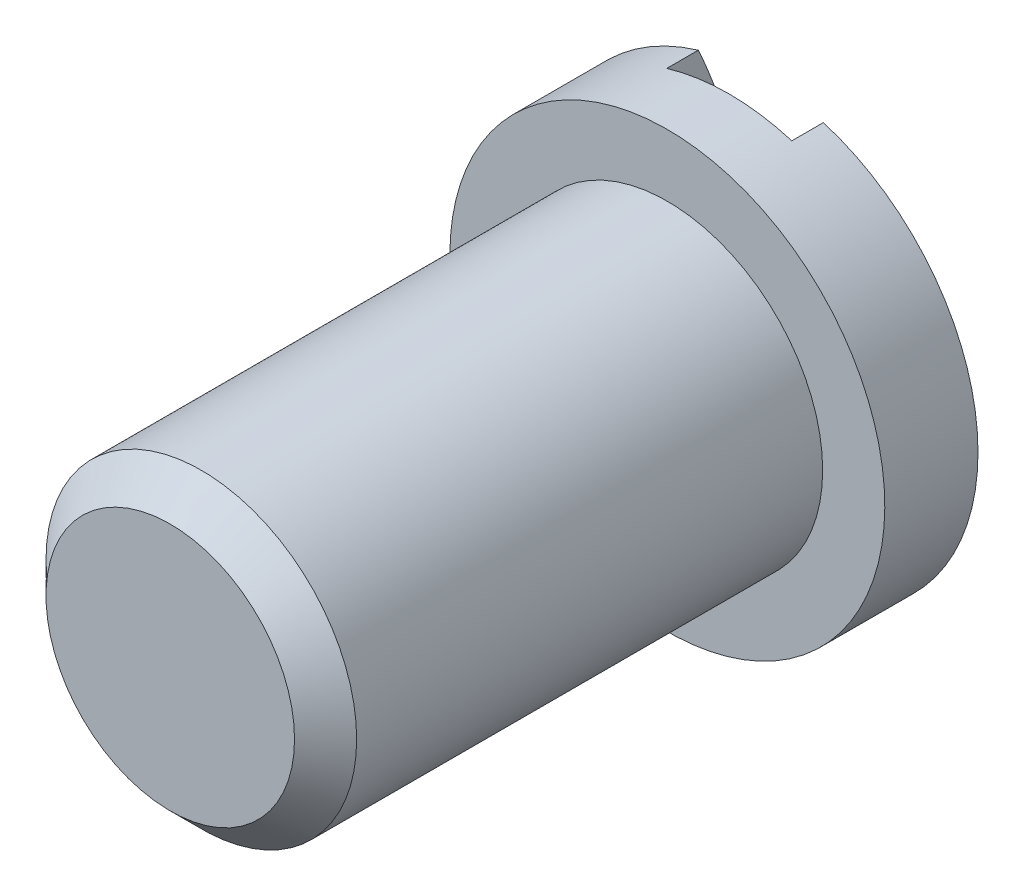
ISO-10303-21;
HEADER;
FILE_DESCRIPTION(('STEP AP214'),'2;1');
FILE_NAME('part.step','',(''),(''),'','','');
FILE_SCHEMA(('AUTOMOTIVE_DESIGN { 1 0 10303 214 1 1 1 1 }'));
ENDSEC;
DATA;
#1=APPLICATION_CONTEXT('core data for automotive mechanical design processes');
#2=APPLICATION_PROTOCOL_DEFINITION('international standard','automotive_design',2000,#1);
#3=PRODUCT_CONTEXT('',#1,'mechanical');
#4=PRODUCT('Part','Part','',(#3));
#5=PRODUCT_RELATED_PRODUCT_CATEGORY('part','',(#4));
#6=PRODUCT_DEFINITION_FORMATION('','',#4);
#7=PRODUCT_DEFINITION_CONTEXT('part definition',#1,'design');
#8=PRODUCT_DEFINITION('design','',#6,#7);
#9=PRODUCT_DEFINITION_SHAPE('','',#8);
#10=(LENGTH_UNIT() NAMED_UNIT(*) SI_UNIT(.MILLI.,.METRE.));
#11=(NAMED_UNIT(*) PLANE_ANGLE_UNIT() SI_UNIT($,.RADIAN.));
#12=(NAMED_UNIT(*) SI_UNIT($,.STERADIAN.) SOLID_ANGLE_UNIT());
#13=UNCERTAINTY_MEASURE_WITH_UNIT(LENGTH_MEASURE(1.E-05),#10,'distance_accuracy_value','');
#14=(GEOMETRIC_REPRESENTATION_CONTEXT(3) GLOBAL_UNCERTAINTY_ASSIGNED_CONTEXT((#13)) GLOBAL_UNIT_ASSIGNED_CONTEXT((#10,
#11,#12)) REPRESENTATION_CONTEXT('',''));
#15=CARTESIAN_POINT('',(0.,0.,0.));
#16=DIRECTION('',(0.,0.,1.));
#17=DIRECTION('',(1.,0.,0.));
#18=AXIS2_PLACEMENT_3D('',#15,#16,#17);
#19=CARTESIAN_POINT('',(0.,0.,-1.5));
#20=DIRECTION('',(0.,0.,1.));
#21=DIRECTION('',(1.,0.,0.));
#22=AXIS2_PLACEMENT_3D('',#19,#20,#21);
#23=CYLINDRICAL_SURFACE('',#22,3.5);
#24=CARTESIAN_POINT('',(0.,0.,0.));
#25=DIRECTION('',(0.,0.,-1.));
#26=DIRECTION('',(-1.,0.,0.));
#27=AXIS2_PLACEMENT_3D('',#24,#25,#26);
#28=CIRCLE('',#27,3.5);
#29=CARTESIAN_POINT('',(-3.5,0.,0.));
#30=VERTEX_POINT('',#29);
#31=EDGE_CURVE('E110',#30,#30,#28,.T.);
#32=ORIENTED_EDGE('',*,*,#31,.T.);
#33=EDGE_LOOP('',(#32));
#34=FACE_BOUND('',#33,.T.);
#35=DIRECTION('',(0.,0.,1.));
#36=VECTOR('',#35,1.);
#37=CARTESIAN_POINT('',(1.01098449068969,3.35080741905364,-1.5));
#38=LINE('',#37,#36);
#39=CARTESIAN_POINT('',(1.01098449068969,3.35080741905364,-0.99227924833618));
#40=VERTEX_POINT('',#39);
#41=CARTESIAN_POINT('',(1.01098449068969,3.35080741905364,-1.5));
#42=VERTEX_POINT('',#41);
#43=EDGE_CURVE('E67',#40,#42,#38,.F.);
#44=ORIENTED_EDGE('',*,*,#43,.F.);
#45=CARTESIAN_POINT('',(0.,0.,-0.99227924833618));
#46=DIRECTION('',(0.,0.,-1.));
#47=DIRECTION('',(-1.,0.,0.));
#48=AXIS2_PLACEMENT_3D('',#45,#46,#47);
#49=CIRCLE('',#48,3.5);
#50=CARTESIAN_POINT('',(-1.00190350036324,3.3535338638457,-0.99227924833618));
#51=VERTEX_POINT('',#50);
#52=EDGE_CURVE('E11',#51,#40,#49,.T.);
#53=ORIENTED_EDGE('',*,*,#52,.F.);
#54=DIRECTION('',(0.,0.,1.));
#55=VECTOR('',#54,1.);
#56=CARTESIAN_POINT('',(-1.00190350036324,3.3535338638457,-1.5));
#57=LINE('',#56,#55);
#58=CARTESIAN_POINT('',(-1.00190350036324,3.3535338638457,-1.5));
#59=VERTEX_POINT('',#58);
#60=EDGE_CURVE('E84',#59,#51,#57,.T.);
#61=ORIENTED_EDGE('',*,*,#60,.F.);
#62=CARTESIAN_POINT('',(0.,0.,-1.5));
#63=DIRECTION('',(0.,0.,-1.));
#64=DIRECTION('',(-1.,0.,0.));
#65=AXIS2_PLACEMENT_3D('',#62,#63,#64);
#66=CIRCLE('',#65,3.5);
#67=CARTESIAN_POINT('',(-1.00190350036324,-3.3535338638457,-1.5));
#68=VERTEX_POINT('',#67);
#69=EDGE_CURVE('E117',#68,#59,#66,.T.);
#70=ORIENTED_EDGE('',*,*,#69,.F.);
#71=DIRECTION('',(0.,0.,1.));
#72=VECTOR('',#71,1.);
#73=CARTESIAN_POINT('',(-1.00190350036324,-3.3535338638457,-1.5));
#74=LINE('',#73,#72);
#75=CARTESIAN_POINT('',(-1.00190350036324,-3.3535338638457,-0.99227924833618));
#76=VERTEX_POINT('',#75);
#77=EDGE_CURVE('E59',#76,#68,#74,.F.);
#78=ORIENTED_EDGE('',*,*,#77,.F.);
#79=CARTESIAN_POINT('',(1.01098449068969,-3.35080741905364,-0.99227924833618));
#80=VERTEX_POINT('',#79);
#81=EDGE_CURVE('E47',#80,#76,#49,.T.);
#82=ORIENTED_EDGE('',*,*,#81,.F.);
#83=DIRECTION('',(0.,0.,1.));
#84=VECTOR('',#83,1.);
#85=CARTESIAN_POINT('',(1.01098449068969,-3.35080741905364,-1.5));
#86=LINE('',#85,#84);
#87=CARTESIAN_POINT('',(1.01098449068969,-3.35080741905364,-1.5));
#88=VERTEX_POINT('',#87);
#89=EDGE_CURVE('E107',#88,#80,#86,.T.);
#90=ORIENTED_EDGE('',*,*,#89,.F.);
#91=EDGE_CURVE('E105',#42,#88,#66,.T.);
#92=ORIENTED_EDGE('',*,*,#91,.F.);
#93=EDGE_LOOP('',(#44,#53,#61,#70,#78,#82,#90,#92));
#94=FACE_BOUND('',#93,.T.);
#95=ADVANCED_FACE('F43',(#34,#94),#23,.T.);
#96=CARTESIAN_POINT('',(0.,0.,5.75625));
#97=DIRECTION('',(0.,0.,1.));
#98=DIRECTION('',(1.,0.,0.));
#99=AXIS2_PLACEMENT_3D('',#96,#97,#98);
#100=SPHERICAL_SURFACE('',#99,8.05625);
#101=ORIENTED_EDGE('',*,*,#91,.T.);
#102=CARTESIAN_POINT('',(1.01098449068969,0.,5.75625));
#103=DIRECTION('',(-1.,0.,0.));
#104=DIRECTION('',(0.,0.,1.));
#105=AXIS2_PLACEMENT_3D('',#102,#103,#104);
#106=CIRCLE('',#105,7.99256369521601);
#107=EDGE_CURVE('E133',#88,#42,#106,.F.);
#108=ORIENTED_EDGE('',*,*,#107,.T.);
#109=EDGE_LOOP('',(#101,#108));
#110=FACE_BOUND('',#109,.T.);
#111=ADVANCED_FACE('F45',(#110),#100,.T.);
#112=ORIENTED_EDGE('',*,*,#69,.T.);
#113=CARTESIAN_POINT('',(-1.00190350036324,0.,5.75625));
#114=DIRECTION('',(1.,0.,0.));
#115=DIRECTION('',(0.,0.,-1.));
#116=AXIS2_PLACEMENT_3D('',#113,#114,#115);
#117=CIRCLE('',#116,7.99370711487855);
#118=EDGE_CURVE('E88',#59,#68,#117,.F.);
#119=ORIENTED_EDGE('',*,*,#118,.T.);
#120=EDGE_LOOP('',(#112,#119));
#121=FACE_BOUND('',#120,.T.);
#122=ADVANCED_FACE('F142',(#121),#100,.T.);
#123=CARTESIAN_POINT('',(0.,0.,8.));
#124=DIRECTION('',(0.,0.,-1.));
#125=DIRECTION('',(-1.,0.,0.));
#126=AXIS2_PLACEMENT_3D('',#123,#124,#125);
#127=CYLINDRICAL_SURFACE('',#126,2.5);
#128=CARTESIAN_POINT('',(0.,0.,7.5));
#129=DIRECTION('',(0.,0.,1.));
#130=DIRECTION('',(1.,0.,0.));
#131=AXIS2_PLACEMENT_3D('',#128,#129,#130);
#132=CIRCLE('',#131,2.5);
#133=CARTESIAN_POINT('',(2.5,0.,7.5));
#134=VERTEX_POINT('',#133);
#135=EDGE_CURVE('E126',#134,#134,#132,.F.);
#136=ORIENTED_EDGE('',*,*,#135,.T.);
#137=EDGE_LOOP('',(#136));
#138=FACE_BOUND('',#137,.T.);
#139=CARTESIAN_POINT('',(0.,0.,0.));
#140=DIRECTION('',(0.,0.,1.));
#141=DIRECTION('',(1.,0.,0.));
#142=AXIS2_PLACEMENT_3D('',#139,#140,#141);
#143=CIRCLE('',#142,2.5);
#144=CARTESIAN_POINT('',(2.5,0.,0.));
#145=VERTEX_POINT('',#144);
#146=EDGE_CURVE('E118',#145,#145,#143,.T.);
#147=ORIENTED_EDGE('',*,*,#146,.T.);
#148=EDGE_LOOP('',(#147));
#149=FACE_BOUND('',#148,.T.);
#150=ADVANCED_FACE('F144',(#138,#149),#127,.T.);
#151=CARTESIAN_POINT('',(0.,0.,8.));
#152=DIRECTION('',(0.,0.,1.));
#153=DIRECTION('',(1.,0.,0.));
#154=AXIS2_PLACEMENT_3D('',#151,#152,#153);
#155=PLANE('',#154);
#156=CARTESIAN_POINT('',(0.,0.,8.));
#157=DIRECTION('',(0.,0.,1.));
#158=DIRECTION('',(1.,0.,0.));
#159=AXIS2_PLACEMENT_3D('',#156,#157,#158);
#160=CIRCLE('',#159,2.);
#161=CARTESIAN_POINT('',(2.,0.,8.));
#162=VERTEX_POINT('',#161);
#163=EDGE_CURVE('E122',#162,#162,#160,.T.);
#164=ORIENTED_EDGE('',*,*,#163,.T.);
#165=EDGE_LOOP('',(#164));
#166=FACE_BOUND('',#165,.T.);
#167=ADVANCED_FACE('F149',(#166),#155,.T.);
#168=CARTESIAN_POINT('',(0.,0.,8.));
#169=DIRECTION('',(0.,0.,-1.));
#170=DIRECTION('',(-1.,0.,0.));
#171=AXIS2_PLACEMENT_3D('',#168,#169,#170);
#172=CONICAL_SURFACE('',#171,2.,0.785398163397446);
#173=ORIENTED_EDGE('',*,*,#135,.F.);
#174=EDGE_LOOP('',(#173));
#175=FACE_BOUND('',#174,.T.);
#176=ORIENTED_EDGE('',*,*,#163,.F.);
#177=EDGE_LOOP('',(#176));
#178=FACE_BOUND('',#177,.T.);
#179=ADVANCED_FACE('F162',(#175,#178),#172,.T.);
#180=CARTESIAN_POINT('',(0.,0.,0.));
#181=DIRECTION('',(0.,0.,-1.));
#182=DIRECTION('',(-1.,0.,0.));
#183=AXIS2_PLACEMENT_3D('',#180,#181,#182);
#184=PLANE('',#183);
#185=ORIENTED_EDGE('',*,*,#146,.F.);
#186=EDGE_LOOP('',(#185));
#187=FACE_BOUND('',#186,.T.);
#188=ORIENTED_EDGE('',*,*,#31,.F.);
#189=EDGE_LOOP('',(#188));
#190=FACE_BOUND('',#189,.T.);
#191=ADVANCED_FACE('F159',(#187,#190),#184,.F.);
#192=CARTESIAN_POINT('',(-1.00190350036324,5.,-0.99227924833618));
#193=DIRECTION('',(0.,0.,-1.));
#194=DIRECTION('',(-1.,0.,0.));
#195=AXIS2_PLACEMENT_3D('',#192,#193,#194);
#196=PLANE('',#195);
#197=ORIENTED_EDGE('',*,*,#52,.T.);
#198=DIRECTION('',(0.,-1.,0.));
#199=VECTOR('',#198,1.);
#200=CARTESIAN_POINT('',(1.01098449068969,5.,-0.99227924833618));
#201=LINE('',#200,#199);
#202=EDGE_CURVE('E100',#40,#80,#201,.T.);
#203=ORIENTED_EDGE('',*,*,#202,.T.);
#204=ORIENTED_EDGE('',*,*,#81,.T.);
#205=DIRECTION('',(0.,-1.,0.));
#206=VECTOR('',#205,1.);
#207=CARTESIAN_POINT('',(-1.00190350036324,5.,-0.99227924833618));
#208=LINE('',#207,#206);
#209=EDGE_CURVE('E87',#51,#76,#208,.T.);
#210=ORIENTED_EDGE('',*,*,#209,.F.);
#211=EDGE_LOOP('',(#197,#203,#204,#210));
#212=FACE_BOUND('',#211,.T.);
#213=ADVANCED_FACE('F96',(#212),#196,.T.);
#214=CARTESIAN_POINT('',(1.01098449068969,5.,-4.12603298652183));
#215=DIRECTION('',(-1.,0.,0.));
#216=DIRECTION('',(0.,0.,1.));
#217=AXIS2_PLACEMENT_3D('',#214,#215,#216);
#218=PLANE('',#217);
#219=ORIENTED_EDGE('',*,*,#89,.T.);
#220=ORIENTED_EDGE('',*,*,#202,.F.);
#221=ORIENTED_EDGE('',*,*,#43,.T.);
#222=ORIENTED_EDGE('',*,*,#107,.F.);
#223=EDGE_LOOP('',(#219,#220,#221,#222));
#224=FACE_BOUND('',#223,.T.);
#225=ADVANCED_FACE('F137',(#224),#218,.T.);
#226=CARTESIAN_POINT('',(-1.00190350036324,5.,-4.12603298652183));
#227=DIRECTION('',(1.,0.,0.));
#228=DIRECTION('',(0.,0.,-1.));
#229=AXIS2_PLACEMENT_3D('',#226,#227,#228);
#230=PLANE('',#229);
#231=ORIENTED_EDGE('',*,*,#60,.T.);
#232=ORIENTED_EDGE('',*,*,#209,.T.);
#233=ORIENTED_EDGE('',*,*,#77,.T.);
#234=ORIENTED_EDGE('',*,*,#118,.F.);
#235=EDGE_LOOP('',(#231,#232,#233,#234));
#236=FACE_BOUND('',#235,.T.);
#237=ADVANCED_FACE('F86',(#236),#230,.T.);
#238=CLOSED_SHELL('',(#95,#111,#122,#150,#167,#179,#191,#213,#225,#237));
#239=MANIFOLD_SOLID_BREP('B2',#238);
#240=ADVANCED_BREP_SHAPE_REPRESENTATION('',(#18,#239),#14);
#241=SHAPE_DEFINITION_REPRESENTATION(#9,#240);
ENDSEC;
END-ISO-10303-21;
